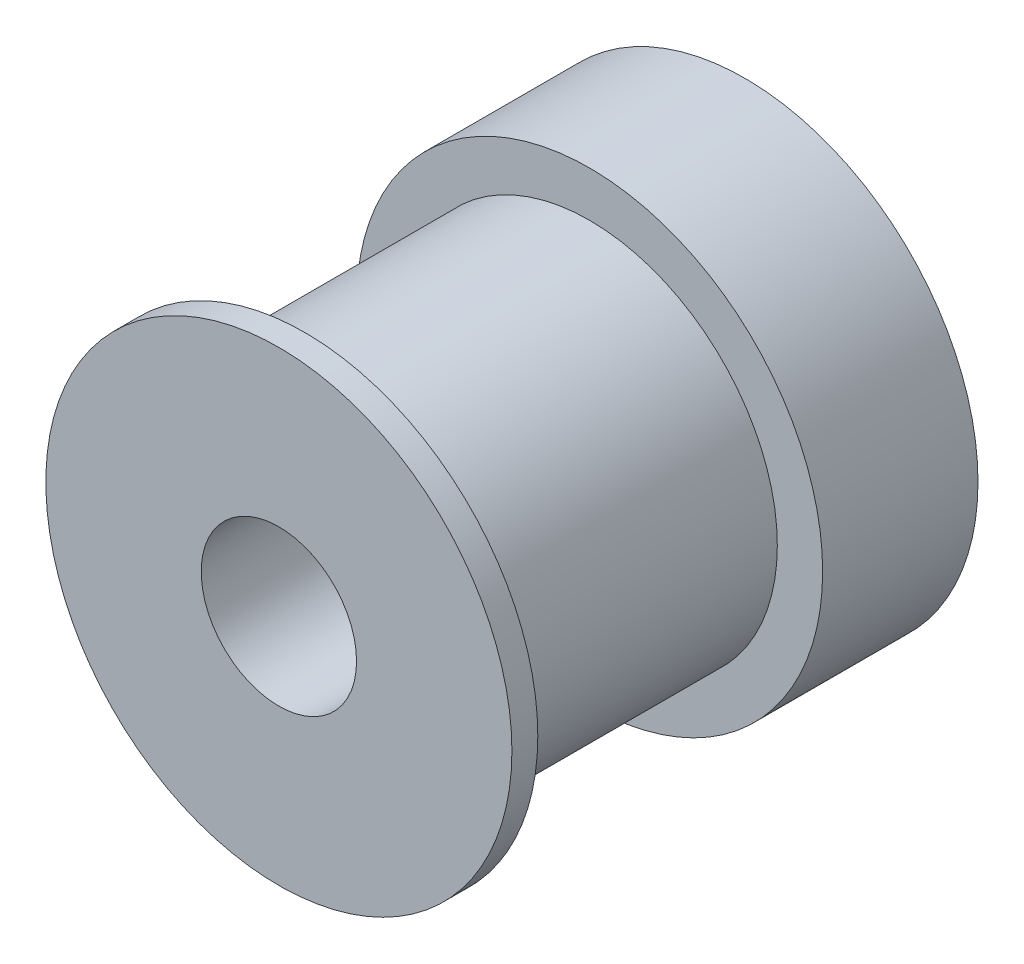
ISO-10303-21;
HEADER;
FILE_DESCRIPTION(('STEP AP214'),'2;1');
FILE_NAME('part.step','',(''),(''),'','','');
FILE_SCHEMA(('AUTOMOTIVE_DESIGN { 1 0 10303 214 1 1 1 1 }'));
ENDSEC;
DATA;
#1=APPLICATION_CONTEXT('core data for automotive mechanical design processes');
#2=APPLICATION_PROTOCOL_DEFINITION('international standard','automotive_design',2000,#1);
#3=PRODUCT_CONTEXT('',#1,'mechanical');
#4=PRODUCT('Part','Part','',(#3));
#5=PRODUCT_RELATED_PRODUCT_CATEGORY('part','',(#4));
#6=PRODUCT_DEFINITION_FORMATION('','',#4);
#7=PRODUCT_DEFINITION_CONTEXT('part definition',#1,'design');
#8=PRODUCT_DEFINITION('design','',#6,#7);
#9=PRODUCT_DEFINITION_SHAPE('','',#8);
#10=(LENGTH_UNIT() NAMED_UNIT(*) SI_UNIT(.MILLI.,.METRE.));
#11=(NAMED_UNIT(*) PLANE_ANGLE_UNIT() SI_UNIT($,.RADIAN.));
#12=(NAMED_UNIT(*) SI_UNIT($,.STERADIAN.) SOLID_ANGLE_UNIT());
#13=UNCERTAINTY_MEASURE_WITH_UNIT(LENGTH_MEASURE(1.E-05),#10,'distance_accuracy_value','');
#14=(GEOMETRIC_REPRESENTATION_CONTEXT(3) GLOBAL_UNCERTAINTY_ASSIGNED_CONTEXT((#13)) GLOBAL_UNIT_ASSIGNED_CONTEXT((#10,
#11,#12)) REPRESENTATION_CONTEXT('',''));
#15=CARTESIAN_POINT('',(0.,0.,0.));
#16=DIRECTION('',(0.,0.,1.));
#17=DIRECTION('',(1.,0.,0.));
#18=AXIS2_PLACEMENT_3D('',#15,#16,#17);
#19=CARTESIAN_POINT('',(0.,0.,6.));
#20=DIRECTION('',(0.,0.,1.));
#21=DIRECTION('',(1.,0.,0.));
#22=AXIS2_PLACEMENT_3D('',#19,#20,#21);
#23=PLANE('',#22);
#24=CARTESIAN_POINT('',(0.,0.,6.));
#25=DIRECTION('',(0.,0.,1.));
#26=DIRECTION('',(1.,0.,0.));
#27=AXIS2_PLACEMENT_3D('',#24,#25,#26);
#28=CIRCLE('',#27,7.25);
#29=CARTESIAN_POINT('',(7.25,0.,6.));
#30=VERTEX_POINT('',#29);
#31=EDGE_CURVE('E10',#30,#30,#28,.T.);
#32=ORIENTED_EDGE('',*,*,#31,.F.);
#33=EDGE_LOOP('',(#32));
#34=FACE_BOUND('',#33,.T.);
#35=CARTESIAN_POINT('',(0.,0.,6.));
#36=DIRECTION('',(0.,0.,1.));
#37=DIRECTION('',(1.,0.,0.));
#38=AXIS2_PLACEMENT_3D('',#35,#36,#37);
#39=CIRCLE('',#38,9.);
#40=CARTESIAN_POINT('',(9.,0.,6.));
#41=VERTEX_POINT('',#40);
#42=EDGE_CURVE('E45',#41,#41,#39,.T.);
#43=ORIENTED_EDGE('',*,*,#42,.T.);
#44=EDGE_LOOP('',(#43));
#45=FACE_BOUND('',#44,.T.);
#46=ADVANCED_FACE('F31',(#34,#45),#23,.T.);
#47=CARTESIAN_POINT('',(0.,0.,0.));
#48=DIRECTION('',(0.,0.,1.));
#49=DIRECTION('',(1.,0.,0.));
#50=AXIS2_PLACEMENT_3D('',#47,#48,#49);
#51=PLANE('',#50);
#52=CARTESIAN_POINT('',(0.,0.,0.));
#53=DIRECTION('',(0.,0.,1.));
#54=DIRECTION('',(1.,0.,0.));
#55=AXIS2_PLACEMENT_3D('',#52,#53,#54);
#56=CIRCLE('',#55,9.);
#57=CARTESIAN_POINT('',(9.,0.,0.));
#58=VERTEX_POINT('',#57);
#59=EDGE_CURVE('E50',#58,#58,#56,.T.);
#60=ORIENTED_EDGE('',*,*,#59,.F.);
#61=EDGE_LOOP('',(#60));
#62=FACE_BOUND('',#61,.T.);
#63=CARTESIAN_POINT('',(0.,0.,0.));
#64=DIRECTION('',(0.,0.,1.));
#65=DIRECTION('',(1.,0.,0.));
#66=AXIS2_PLACEMENT_3D('',#63,#64,#65);
#67=CIRCLE('',#66,3.);
#68=CARTESIAN_POINT('',(3.,0.,0.));
#69=VERTEX_POINT('',#68);
#70=EDGE_CURVE('E56',#69,#69,#67,.T.);
#71=ORIENTED_EDGE('',*,*,#70,.T.);
#72=EDGE_LOOP('',(#71));
#73=FACE_BOUND('',#72,.T.);
#74=ADVANCED_FACE('F62',(#62,#73),#51,.F.);
#75=CARTESIAN_POINT('',(0.,0.,6.));
#76=DIRECTION('',(0.,0.,-1.));
#77=DIRECTION('',(-1.,0.,0.));
#78=AXIS2_PLACEMENT_3D('',#75,#76,#77);
#79=CYLINDRICAL_SURFACE('',#78,9.);
#80=CARTESIAN_POINT('',(0.,-9.,5.5));
#81=CARTESIAN_POINT('',(0.0836345429749289,-8.99999856701294,5.49999664663131));
#82=CARTESIAN_POINT('',(0.167314729103293,-8.9988220674782,5.49298163501865));
#83=CARTESIAN_POINT('',(0.332328133003826,-8.99424206964832,5.46511860474081));
#84=CARTESIAN_POINT('',(0.413659120775548,-8.99083652354334,5.44425786585304));
#85=CARTESIAN_POINT('',(0.571562848327586,-8.9821804094187,5.38935073084435));
#86=CARTESIAN_POINT('',(0.64813942105914,-8.97693135095516,5.35531512061566));
#87=CARTESIAN_POINT('',(0.794485105186767,-8.96516536249242,5.27505262476856));
#88=CARTESIAN_POINT('',(0.864254993927155,-8.9586485775266,5.2288271335102));
#89=CARTESIAN_POINT('',(0.995683568575009,-8.94499990474988,5.12502694970772));
#90=CARTESIAN_POINT('',(1.05726774212098,-8.93786323088914,5.06735853121832));
#91=CARTESIAN_POINT('',(1.16993309919596,-8.92381576126039,4.94251121891631));
#92=CARTESIAN_POINT('',(1.22101361963458,-8.916904979776,4.87533172512603));
#93=CARTESIAN_POINT('',(1.31152027536308,-8.90404539455868,4.73285742028177));
#94=CARTESIAN_POINT('',(1.3508727317166,-8.89810277454982,4.65751519791714));
#95=CARTESIAN_POINT('',(1.41633501924673,-8.88791873876805,4.50117426141962));
#96=CARTESIAN_POINT('',(1.44244574493937,-8.88367720808584,4.42017592979342));
#97=CARTESIAN_POINT('',(1.48044862667088,-8.87742322105653,4.25561183508608));
#98=CARTESIAN_POINT('',(1.49246941748124,-8.8753906109142,4.17207655809916));
#99=CARTESIAN_POINT('',(1.50235003517393,-8.87372363361989,4.00415183386992));
#100=CARTESIAN_POINT('',(1.5002108642334,-8.87408909674328,3.91976244749962));
#101=CARTESIAN_POINT('',(1.48193705903769,-8.87715857318133,3.75344328323473));
#102=CARTESIAN_POINT('',(1.46594692913386,-8.8798384399135,3.67149711787286));
#103=CARTESIAN_POINT('',(1.42065188424207,-8.88719697126605,3.51146720930252));
#104=CARTESIAN_POINT('',(1.39134651259184,-8.89187570443963,3.43338359866687));
#105=CARTESIAN_POINT('',(1.32010634765635,-8.9027308760046,3.28286270593545));
#106=CARTESIAN_POINT('',(1.27811154832783,-8.90891440264395,3.21045435635126));
#107=CARTESIAN_POINT('',(1.18272721053446,-8.92207751049005,3.07365735967697));
#108=CARTESIAN_POINT('',(1.12933675239257,-8.92905715592572,3.00926936052704));
#109=CARTESIAN_POINT('',(1.01188932729543,-8.94313216727871,2.88950434851559));
#110=CARTESIAN_POINT('',(0.947708378323875,-8.95022789538991,2.83424888887595));
#111=CARTESIAN_POINT('',(0.810921149388987,-8.96365560838034,2.7352733424008));
#112=CARTESIAN_POINT('',(0.738314815143852,-8.96998758833847,2.69155332989006));
#113=CARTESIAN_POINT('',(0.586623549700026,-8.98118335735747,2.61687866371823));
#114=CARTESIAN_POINT('',(0.507533235338796,-8.98604591044468,2.58593474840125));
#115=CARTESIAN_POINT('',(0.345179007361638,-8.99374501807596,2.53780347085241));
#116=CARTESIAN_POINT('',(0.26191544350768,-8.99658174210284,2.52061495781577));
#117=CARTESIAN_POINT('',(0.0946259407809733,-8.99988677905612,2.50064718492332));
#118=CARTESIAN_POINT('',(0.010620442290606,-9.00038251807671,2.49770105691664));
#119=CARTESIAN_POINT('',(-0.156683863733933,-8.99902484652702,2.50585680665687));
#120=CARTESIAN_POINT('',(-0.239982698335224,-8.99717152634471,2.51695814388024));
#121=CARTESIAN_POINT('',(-0.402993705328059,-8.99134096162921,2.55275490960129));
#122=CARTESIAN_POINT('',(-0.482724521031229,-8.98737662880787,2.57736772503408));
#123=CARTESIAN_POINT('',(-0.636928130916266,-8.97776678673215,2.63940071091972));
#124=CARTESIAN_POINT('',(-0.711400629545832,-8.97212118307212,2.67682160058116));
#125=CARTESIAN_POINT('',(-0.853698413681376,-8.95970709781444,2.76379067481807));
#126=CARTESIAN_POINT('',(-0.92145915056229,-8.95292913532213,2.81344309370035));
#127=CARTESIAN_POINT('',(-1.04774615130161,-8.93903080435141,2.92332238923104));
#128=CARTESIAN_POINT('',(-1.10627174381795,-8.93191041102928,2.983550033966));
#129=CARTESIAN_POINT('',(-1.2130456677948,-8.91804105141507,3.11361852884285));
#130=CARTESIAN_POINT('',(-1.26118125666823,-8.91129669682264,3.18355249930865));
#131=CARTESIAN_POINT('',(-1.34502138617699,-8.8990291786673,3.33061178148312));
#132=CARTESIAN_POINT('',(-1.38072632086189,-8.89350597639612,3.4077368651365));
#133=CARTESIAN_POINT('',(-1.43852299888389,-8.88434072218623,3.56667383968728));
#134=CARTESIAN_POINT('',(-1.46067085952877,-8.88069092586639,3.64846485701829));
#135=CARTESIAN_POINT('',(-1.49090127226697,-8.87566630101156,3.81467207753306));
#136=CARTESIAN_POINT('',(-1.4989850471677,-8.87429127469633,3.89908805183923));
#137=CARTESIAN_POINT('',(-1.50082371962841,-8.87398039850407,4.06702309957745));
#138=CARTESIAN_POINT('',(-1.49475608167511,-8.8750143390339,4.15054022714517));
#139=CARTESIAN_POINT('',(-1.46884790337411,-8.87933868872237,4.31534754883046));
#140=CARTESIAN_POINT('',(-1.44900740766749,-8.88262909056728,4.39663775016512));
#141=CARTESIAN_POINT('',(-1.39618469375694,-8.89108413769031,4.55461506237557));
#142=CARTESIAN_POINT('',(-1.36321775436026,-8.89624660331802,4.63130740603362));
#143=CARTESIAN_POINT('',(-1.28509620234954,-8.90786621353324,4.77810140151691));
#144=CARTESIAN_POINT('',(-1.23994098524914,-8.91432342233039,4.84820272622328));
#145=CARTESIAN_POINT('',(-1.13809133062329,-8.92790072427373,4.98072134986465));
#146=CARTESIAN_POINT('',(-1.08126633815619,-8.93502777345781,5.04303761002017));
#147=CARTESIAN_POINT('',(-0.957965418828137,-8.94908623416505,5.15731096268496));
#148=CARTESIAN_POINT('',(-0.891487267747581,-8.95601760015928,5.2092656611829));
#149=CARTESIAN_POINT('',(-0.750221501784168,-8.96895917785332,5.30166896091997));
#150=CARTESIAN_POINT('',(-0.67537967251969,-8.97496269751862,5.34203562358777));
#151=CARTESIAN_POINT('',(-0.519907841627388,-8.98530700561065,5.40956169076595));
#152=CARTESIAN_POINT('',(-0.439283696898005,-8.98964944906489,5.43673424864782));
#153=CARTESIAN_POINT('',(-0.29862198602724,-8.99523474499773,5.471203164476));
#154=CARTESIAN_POINT('',(-0.239435298179068,-8.99701216364015,5.48198468176958));
#155=CARTESIAN_POINT('',(-0.120173586191886,-8.99939529591672,5.49638424270685));
#156=CARTESIAN_POINT('',(-0.0600985773650966,-9.00000102972385,5.50000240968242));
#157=CARTESIAN_POINT('',(0.,-9.,5.5));
#158=B_SPLINE_CURVE_WITH_KNOTS('',3,(#80,#81,#82,#83,#84,#85,#86,#87,#88,#89,#90,#91,#92,#93,
#94,#95,#96,#97,#98,#99,#100,#101,#102,#103,#104,#105,#106,#107,#108,#109,#110,#111,#112,#113,
#114,#115,#116,#117,#118,#119,#120,#121,#122,#123,#124,#125,#126,#127,#128,#129,#130,#131,#132,
#133,#134,#135,#136,#137,#138,#139,#140,#141,#142,#143,#144,#145,#146,#147,#148,#149,#150,#151,
#152,#153,#154,#155,#156,#157),.UNSPECIFIED.,.T.,.F.,(4,2,2,2,2,2,2,2,2,2,2,2,2,2,2,2,2,2,2,2,2,
2,2,2,2,2,2,2,2,2,2,2,2,2,2,2,2,2,4),(0.,0.250683950963106,0.501598527417252,0.752308120215162,
1.00298904760487,1.25581494637399,1.50865680101914,1.76305512494304,2.01743626125709,
2.26947646262054,2.52149882592532,2.77092313056245,3.02035599015229,3.27098733979534,
3.52163892408344,3.77539661946796,4.02915594981509,4.28312813349542,4.53707906712689,
4.78804730094838,5.03900587821516,5.28844684203849,5.5379018149564,5.78956095376214,
6.0412383783257,6.29552293204571,6.54979942425566,6.80301613405063,7.05621082671971,
7.3062474571362,7.5562832771288,7.80602890935734,8.05578693017602,8.30850830516035,
8.56128800327383,8.8158133896432,9.07008451278043,9.25022548898411,9.43036336366181),.UNSPECIFIED.);
#159=CARTESIAN_POINT('',(0.,-9.,5.5));
#160=VERTEX_POINT('',#159);
#161=EDGE_CURVE('E77',#160,#160,#158,.T.);
#162=ORIENTED_EDGE('',*,*,#161,.T.);
#163=EDGE_LOOP('',(#162));
#164=FACE_BOUND('',#163,.T.);
#165=ORIENTED_EDGE('',*,*,#42,.F.);
#166=EDGE_LOOP('',(#165));
#167=FACE_BOUND('',#166,.T.);
#168=ORIENTED_EDGE('',*,*,#59,.T.);
#169=EDGE_LOOP('',(#168));
#170=FACE_BOUND('',#169,.T.);
#171=ADVANCED_FACE('F33',(#164,#167,#170),#79,.T.);
#172=CARTESIAN_POINT('',(0.,0.,6.));
#173=DIRECTION('',(0.,0.,-1.));
#174=DIRECTION('',(-1.,0.,0.));
#175=AXIS2_PLACEMENT_3D('',#172,#173,#174);
#176=CYLINDRICAL_SURFACE('',#175,3.);
#177=CARTESIAN_POINT('',(0.,-3.,5.5));
#178=CARTESIAN_POINT('',(0.0788579444268502,-2.99999570107562,5.49999504652421));
#179=CARTESIAN_POINT('',(0.157809899546344,-2.99685736529635,5.49374489031842));
#180=CARTESIAN_POINT('',(0.313380352903344,-2.98461234055736,5.46902067948769));
#181=CARTESIAN_POINT('',(0.389994130070444,-2.97549431743379,5.45052341050328));
#182=CARTESIAN_POINT('',(0.538400317320673,-2.95224419105063,5.40220928707506));
#183=CARTESIAN_POINT('',(0.61021020440872,-2.93813158766306,5.37243642362805));
#184=CARTESIAN_POINT('',(0.747708925209898,-2.90618664773642,5.30264406795252));
#185=CARTESIAN_POINT('',(0.813398240985089,-2.88835460450288,5.2626253836267));
#186=CARTESIAN_POINT('',(0.941261726642864,-2.84934387387093,5.17072412577207));
#187=CARTESIAN_POINT('',(1.00298281668316,-2.82802798691306,5.11827028114054));
#188=CARTESIAN_POINT('',(1.11716916730047,-2.78489955370115,5.00421778112945));
#189=CARTESIAN_POINT('',(1.16962737466015,-2.76308664313552,4.94261222234134));
#190=CARTESIAN_POINT('',(1.26787800067542,-2.71948426796021,4.80627497571493));
#191=CARTESIAN_POINT('',(1.31283800332745,-2.69782780455198,4.73089585248113));
#192=CARTESIAN_POINT('',(1.38925234033604,-2.65928968158481,4.57244899602068));
#193=CARTESIAN_POINT('',(1.4207163224495,-2.64240461410484,4.48938680691588));
#194=CARTESIAN_POINT('',(1.46719866328288,-2.61686800556713,4.32300234186712));
#195=CARTESIAN_POINT('',(1.48308878562066,-2.6077840737557,4.23999332189891));
#196=CARTESIAN_POINT('',(1.50064048996327,-2.59772834922792,4.07203174333079));
#197=CARTESIAN_POINT('',(1.50231613255961,-2.59674854014932,3.98708118869327));
#198=CARTESIAN_POINT('',(1.49203093075844,-2.60266395385873,3.82857096352695));
#199=CARTESIAN_POINT('',(1.48167683930523,-2.6086314549302,3.75486395316542));
#200=CARTESIAN_POINT('',(1.4504097735854,-2.62614343100775,3.61041713594044));
#201=CARTESIAN_POINT('',(1.42949343584648,-2.63768968247664,3.53967828204203));
#202=CARTESIAN_POINT('',(1.37731467057901,-2.66531214619112,3.40115630115151));
#203=CARTESIAN_POINT('',(1.34582260067399,-2.68148760995998,3.33348040182132));
#204=CARTESIAN_POINT('',(1.273562531502,-2.71655106422106,3.20404856111499));
#205=CARTESIAN_POINT('',(1.2327903657187,-2.73544027170286,3.14229529659987));
#206=CARTESIAN_POINT('',(1.13709908236918,-2.77669736854929,3.01821812088516));
#207=CARTESIAN_POINT('',(1.08104168755392,-2.79920265355119,2.95681468963576));
#208=CARTESIAN_POINT('',(0.95933336811206,-2.84321434950611,2.84389687211365));
#209=CARTESIAN_POINT('',(0.893677884861428,-2.86472027938201,2.79238721194918));
#210=CARTESIAN_POINT('',(0.750774758747772,-2.90552980924446,2.69847150845541));
#211=CARTESIAN_POINT('',(0.673130387399113,-2.92468476243011,2.65659929133139));
#212=CARTESIAN_POINT('',(0.510699323233195,-2.95736821681863,2.58685445643549));
#213=CARTESIAN_POINT('',(0.425918364397913,-2.9709011841533,2.55897072247725));
#214=CARTESIAN_POINT('',(0.259149737491053,-2.98986500612153,2.52028689442499));
#215=CARTESIAN_POINT('',(0.177512295822489,-2.99587407451965,2.50826314637983));
#216=CARTESIAN_POINT('',(0.0131693999240275,-3.00109520188655,2.49780290329827));
#217=CARTESIAN_POINT('',(-0.069535529804863,-3.00031048081978,2.4993599715408));
#218=CARTESIAN_POINT('',(-0.22684945797898,-2.99236788380152,2.51531003262812));
#219=CARTESIAN_POINT('',(-0.301589112074895,-2.98570868532253,2.52869879909499));
#220=CARTESIAN_POINT('',(-0.447610338452911,-2.9673325697226,2.56635710784268));
#221=CARTESIAN_POINT('',(-0.51889152853663,-2.95561509501618,2.59062784968024));
#222=CARTESIAN_POINT('',(-0.658332912674359,-2.92776377120382,2.64999769964955));
#223=CARTESIAN_POINT('',(-0.726345595508704,-2.91151322654446,2.68538657517443));
#224=CARTESIAN_POINT('',(-0.855692042548907,-2.87615961476126,2.76566130346985));
#225=CARTESIAN_POINT('',(-0.917022944664887,-2.85705533350407,2.81055120189309));
#226=CARTESIAN_POINT('',(-1.03765153393382,-2.81562332004297,2.91364063799607));
#227=CARTESIAN_POINT('',(-1.09615811672854,-2.79316327265249,2.97271430266772));
#228=CARTESIAN_POINT('',(-1.20278448167828,-2.7489358741323,3.09988772691659));
#229=CARTESIAN_POINT('',(-1.25089707856781,-2.72716901100071,3.16799367827188));
#230=CARTESIAN_POINT('',(-1.33756187171853,-2.68576788309734,3.31546548125946));
#231=CARTESIAN_POINT('',(-1.37553824370037,-2.66628794383591,3.39521689914172));
#232=CARTESIAN_POINT('',(-1.43712423890206,-2.63361108441202,3.56126510136245));
#233=CARTESIAN_POINT('',(-1.46075237380052,-2.62040607332625,3.64755328970034));
#234=CARTESIAN_POINT('',(-1.49079253120031,-2.60342251538703,3.81536533432706));
#235=CARTESIAN_POINT('',(-1.49863949460818,-2.59886075197597,3.89655138015286));
#236=CARTESIAN_POINT('',(-1.5010337315643,-2.59748031962405,4.05917060074679));
#237=CARTESIAN_POINT('',(-1.49558676993486,-2.60065829439585,4.14060365310679));
#238=CARTESIAN_POINT('',(-1.47288918838996,-2.61356793076615,4.29322525230016));
#239=CARTESIAN_POINT('',(-1.45681247151455,-2.62264641723988,4.36465070521711));
#240=CARTESIAN_POINT('',(-1.41476303733662,-2.64556524281479,4.50371217913655));
#241=CARTESIAN_POINT('',(-1.38878713673988,-2.65940711354503,4.57134697313805));
#242=CARTESIAN_POINT('',(-1.32572361795085,-2.69142795546804,4.70593727647981));
#243=CARTESIAN_POINT('',(-1.28800670672355,-2.70983583593881,4.77254185274354));
#244=CARTESIAN_POINT('',(-1.20322645745609,-2.74852997452291,4.89891180427189));
#245=CARTESIAN_POINT('',(-1.15615825686234,-2.76881720693416,4.95867359578167));
#246=CARTESIAN_POINT('',(-1.04730498999206,-2.81193484737138,5.07721297353201));
#247=CARTESIAN_POINT('',(-0.984426634495892,-2.83477474959942,5.13498865352544));
#248=CARTESIAN_POINT('',(-0.849232209349796,-2.87816628389896,5.2393944751529));
#249=CARTESIAN_POINT('',(-0.776911084957796,-2.89871667939293,5.28601860920486));
#250=CARTESIAN_POINT('',(-0.623897395174418,-2.93547014349806,5.3668545440681));
#251=CARTESIAN_POINT('',(-0.543149255665096,-2.95164144740899,5.4009762538547));
#252=CARTESIAN_POINT('',(-0.37611315170713,-2.9775201194848,5.45471225163611));
#253=CARTESIAN_POINT('',(-0.28984169938365,-2.98724585044602,5.47436777020857));
#254=CARTESIAN_POINT('',(-0.168902919736342,-2.99543192870217,5.49084611662861));
#255=CARTESIAN_POINT('',(-0.135242819162346,-2.99714048010376,5.49427396129951));
#256=CARTESIAN_POINT('',(-0.0677275977076366,-2.99942545465223,5.49885199827113));
#257=CARTESIAN_POINT('',(-0.0338724714699423,-3.00000184655071,5.50000212770531));
#258=CARTESIAN_POINT('',(0.,-3.,5.5));
#259=B_SPLINE_CURVE_WITH_KNOTS('',3,(#177,#178,#179,#180,#181,#182,#183,#184,#185,#186,#187,
#188,#189,#190,#191,#192,#193,#194,#195,#196,#197,#198,#199,#200,#201,#202,#203,#204,#205,#206,
#207,#208,#209,#210,#211,#212,#213,#214,#215,#216,#217,#218,#219,#220,#221,#222,#223,#224,#225,
#226,#227,#228,#229,#230,#231,#232,#233,#234,#235,#236,#237,#238,#239,#240,#241,#242,#243,#244,
#245,#246,#247,#248,#249,#250,#251,#252,#253,#254,#255,#256,#257,#258),.UNSPECIFIED.,.T.,.F.,(4,
2,2,2,2,2,2,2,2,2,2,2,2,2,2,2,2,2,2,2,2,2,2,2,2,2,2,2,2,2,2,2,2,2,2,2,2,2,2,2,4),(0.,
0.236436386130439,0.473322224563796,0.709293233238448,0.945245640872351,1.19547263807713,
1.44588935648105,1.71572589646129,1.98536921847421,2.23887018210344,2.49212035993531,
2.71508568613981,2.93812205888518,3.16635360252731,3.39468781890333,3.65197412000818,
3.9093830189803,4.17874533321661,4.44789325368419,4.69474935707018,4.94148846767214,
5.16910359759183,5.39674382446397,5.63089284041848,5.86514176122509,6.12239415966628,
6.37982382923148,6.64972023242589,6.91926767918176,7.1629396125457,7.40650589797017,
7.62686895373284,7.84730293182527,8.08254685170431,8.31791341715446,8.58187864135757,
8.84598575071869,9.1119602049529,9.37717362931724,9.47872920200875,9.58028757766599),.UNSPECIFIED.);
#260=CARTESIAN_POINT('',(0.,-3.,5.5));
#261=VERTEX_POINT('',#260);
#262=EDGE_CURVE('E36',#261,#261,#259,.T.);
#263=ORIENTED_EDGE('',*,*,#262,.F.);
#264=EDGE_LOOP('',(#263));
#265=FACE_BOUND('',#264,.T.);
#266=ORIENTED_EDGE('',*,*,#70,.F.);
#267=EDGE_LOOP('',(#266));
#268=FACE_BOUND('',#267,.T.);
#269=CARTESIAN_POINT('',(0.,0.,18.));
#270=DIRECTION('',(0.,0.,1.));
#271=DIRECTION('',(1.,0.,0.));
#272=AXIS2_PLACEMENT_3D('',#269,#270,#271);
#273=CIRCLE('',#272,3.);
#274=CARTESIAN_POINT('',(3.,0.,18.));
#275=VERTEX_POINT('',#274);
#276=EDGE_CURVE('E74',#275,#275,#273,.T.);
#277=ORIENTED_EDGE('',*,*,#276,.T.);
#278=EDGE_LOOP('',(#277));
#279=FACE_BOUND('',#278,.T.);
#280=ADVANCED_FACE('F67',(#265,#268,#279),#176,.F.);
#281=CARTESIAN_POINT('',(0.,0.,17.));
#282=DIRECTION('',(0.,0.,-1.));
#283=DIRECTION('',(-1.,0.,0.));
#284=AXIS2_PLACEMENT_3D('',#281,#282,#283);
#285=CYLINDRICAL_SURFACE('',#284,7.25);
#286=CARTESIAN_POINT('',(0.,0.,17.));
#287=DIRECTION('',(0.,0.,1.));
#288=DIRECTION('',(1.,0.,0.));
#289=AXIS2_PLACEMENT_3D('',#286,#287,#288);
#290=CIRCLE('',#289,7.25);
#291=CARTESIAN_POINT('',(7.25,0.,17.));
#292=VERTEX_POINT('',#291);
#293=EDGE_CURVE('E54',#292,#292,#290,.T.);
#294=ORIENTED_EDGE('',*,*,#293,.F.);
#295=EDGE_LOOP('',(#294));
#296=FACE_BOUND('',#295,.T.);
#297=ORIENTED_EDGE('',*,*,#31,.T.);
#298=EDGE_LOOP('',(#297));
#299=FACE_BOUND('',#298,.T.);
#300=ADVANCED_FACE('F70',(#296,#299),#285,.T.);
#301=CARTESIAN_POINT('',(0.,0.,18.));
#302=DIRECTION('',(0.,0.,1.));
#303=DIRECTION('',(1.,0.,0.));
#304=AXIS2_PLACEMENT_3D('',#301,#302,#303);
#305=PLANE('',#304);
#306=CARTESIAN_POINT('',(0.,0.,18.));
#307=DIRECTION('',(0.,0.,1.));
#308=DIRECTION('',(1.,0.,0.));
#309=AXIS2_PLACEMENT_3D('',#306,#307,#308);
#310=CIRCLE('',#309,9.);
#311=CARTESIAN_POINT('',(9.,0.,18.));
#312=VERTEX_POINT('',#311);
#313=EDGE_CURVE('E80',#312,#312,#310,.T.);
#314=ORIENTED_EDGE('',*,*,#313,.T.);
#315=EDGE_LOOP('',(#314));
#316=FACE_BOUND('',#315,.T.);
#317=ORIENTED_EDGE('',*,*,#276,.F.);
#318=EDGE_LOOP('',(#317));
#319=FACE_BOUND('',#318,.T.);
#320=ADVANCED_FACE('F97',(#316,#319),#305,.T.);
#321=CARTESIAN_POINT('',(0.,0.,17.));
#322=DIRECTION('',(0.,0.,1.));
#323=DIRECTION('',(1.,0.,0.));
#324=AXIS2_PLACEMENT_3D('',#321,#322,#323);
#325=PLANE('',#324);
#326=ORIENTED_EDGE('',*,*,#293,.T.);
#327=EDGE_LOOP('',(#326));
#328=FACE_BOUND('',#327,.T.);
#329=CARTESIAN_POINT('',(0.,0.,17.));
#330=DIRECTION('',(0.,0.,1.));
#331=DIRECTION('',(1.,0.,0.));
#332=AXIS2_PLACEMENT_3D('',#329,#330,#331);
#333=CIRCLE('',#332,9.);
#334=CARTESIAN_POINT('',(9.,0.,17.));
#335=VERTEX_POINT('',#334);
#336=EDGE_CURVE('E76',#335,#335,#333,.T.);
#337=ORIENTED_EDGE('',*,*,#336,.F.);
#338=EDGE_LOOP('',(#337));
#339=FACE_BOUND('',#338,.T.);
#340=ADVANCED_FACE('F93',(#328,#339),#325,.F.);
#341=CARTESIAN_POINT('',(0.,0.,18.));
#342=DIRECTION('',(0.,0.,-1.));
#343=DIRECTION('',(-1.,0.,0.));
#344=AXIS2_PLACEMENT_3D('',#341,#342,#343);
#345=CYLINDRICAL_SURFACE('',#344,9.);
#346=ORIENTED_EDGE('',*,*,#313,.F.);
#347=EDGE_LOOP('',(#346));
#348=FACE_BOUND('',#347,.T.);
#349=ORIENTED_EDGE('',*,*,#336,.T.);
#350=EDGE_LOOP('',(#349));
#351=FACE_BOUND('',#350,.T.);
#352=ADVANCED_FACE('F121',(#348,#351),#345,.T.);
#353=CARTESIAN_POINT('',(0.,-9.,4.));
#354=DIRECTION('',(0.,1.,0.));
#355=DIRECTION('',(0.,0.,1.));
#356=AXIS2_PLACEMENT_3D('',#353,#354,#355);
#357=CYLINDRICAL_SURFACE('',#356,1.5);
#358=ORIENTED_EDGE('',*,*,#262,.T.);
#359=EDGE_LOOP('',(#358));
#360=FACE_BOUND('',#359,.T.);
#361=ORIENTED_EDGE('',*,*,#161,.F.);
#362=EDGE_LOOP('',(#361));
#363=FACE_BOUND('',#362,.T.);
#364=ADVANCED_FACE('F119',(#360,#363),#357,.F.);
#365=CLOSED_SHELL('',(#46,#74,#171,#280,#300,#320,#340,#352,#364));
#366=MANIFOLD_SOLID_BREP('B2',#365);
#367=ADVANCED_BREP_SHAPE_REPRESENTATION('',(#18,#366),#14);
#368=SHAPE_DEFINITION_REPRESENTATION(#9,#367);
ENDSEC;
END-ISO-10303-21;
